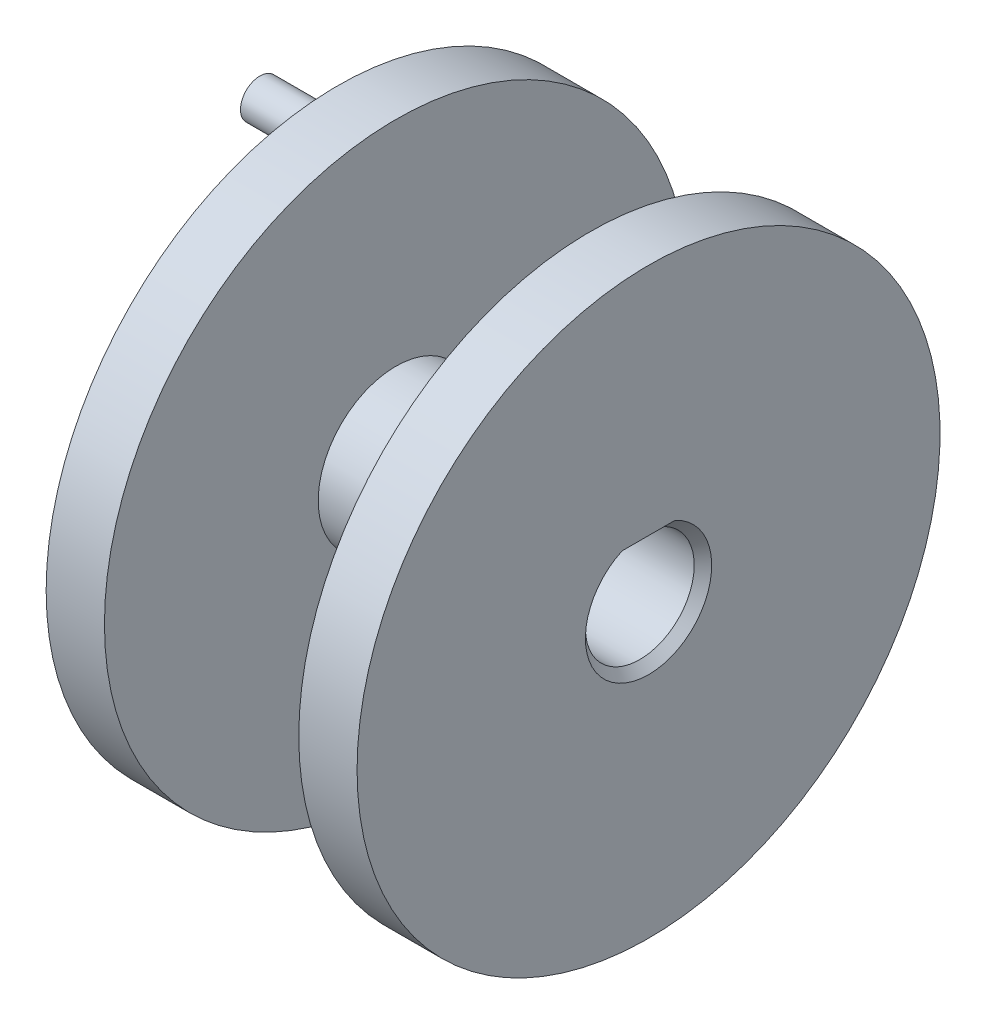
ISO-10303-21;
HEADER;
FILE_DESCRIPTION(('STEP AP214'),'2;1');
FILE_NAME('part.step','',(''),(''),'','','');
FILE_SCHEMA(('AUTOMOTIVE_DESIGN { 1 0 10303 214 1 1 1 1 }'));
ENDSEC;
DATA;
#1=APPLICATION_CONTEXT('core data for automotive mechanical design processes');
#2=APPLICATION_PROTOCOL_DEFINITION('international standard','automotive_design',2000,#1);
#3=PRODUCT_CONTEXT('',#1,'mechanical');
#4=PRODUCT('Part','Part','',(#3));
#5=PRODUCT_RELATED_PRODUCT_CATEGORY('part','',(#4));
#6=PRODUCT_DEFINITION_FORMATION('','',#4);
#7=PRODUCT_DEFINITION_CONTEXT('part definition',#1,'design');
#8=PRODUCT_DEFINITION('design','',#6,#7);
#9=PRODUCT_DEFINITION_SHAPE('','',#8);
#10=(LENGTH_UNIT() NAMED_UNIT(*) SI_UNIT(.MILLI.,.METRE.));
#11=(NAMED_UNIT(*) PLANE_ANGLE_UNIT() SI_UNIT($,.RADIAN.));
#12=(NAMED_UNIT(*) SI_UNIT($,.STERADIAN.) SOLID_ANGLE_UNIT());
#13=UNCERTAINTY_MEASURE_WITH_UNIT(LENGTH_MEASURE(1.E-05),#10,'distance_accuracy_value','');
#14=(GEOMETRIC_REPRESENTATION_CONTEXT(3) GLOBAL_UNCERTAINTY_ASSIGNED_CONTEXT((#13)) GLOBAL_UNIT_ASSIGNED_CONTEXT((#10,
#11,#12)) REPRESENTATION_CONTEXT('',''));
#15=CARTESIAN_POINT('',(0.,0.,0.));
#16=DIRECTION('',(0.,0.,1.));
#17=DIRECTION('',(1.,0.,0.));
#18=AXIS2_PLACEMENT_3D('',#15,#16,#17);
#19=CARTESIAN_POINT('',(8.,0.,0.));
#20=DIRECTION('',(1.,0.,0.));
#21=DIRECTION('',(0.,0.,-1.));
#22=AXIS2_PLACEMENT_3D('',#19,#20,#21);
#23=PLANE('',#22);
#24=DIRECTION('',(0.,0.,-1.));
#25=VECTOR('',#24,1.);
#26=CARTESIAN_POINT('',(8.,2.95000000000001,0.));
#27=LINE('',#26,#25);
#28=CARTESIAN_POINT('',(8.,2.95000000000001,1.36381816969859));
#29=VERTEX_POINT('',#28);
#30=CARTESIAN_POINT('',(8.,2.95000000000001,-1.36381816969859));
#31=VERTEX_POINT('',#30);
#32=EDGE_CURVE('E72',#29,#31,#27,.T.);
#33=ORIENTED_EDGE('',*,*,#32,.T.);
#34=CARTESIAN_POINT('',(8.,0.,0.));
#35=DIRECTION('',(1.,0.,0.));
#36=DIRECTION('',(0.,0.,-1.));
#37=AXIS2_PLACEMENT_3D('',#34,#35,#36);
#38=CIRCLE('',#37,3.25000000000001);
#39=EDGE_CURVE('E65',#31,#29,#38,.F.);
#40=ORIENTED_EDGE('',*,*,#39,.T.);
#41=EDGE_LOOP('',(#33,#40));
#42=FACE_BOUND('',#41,.T.);
#43=CARTESIAN_POINT('',(8.,0.,0.));
#44=DIRECTION('',(-1.,0.,0.));
#45=DIRECTION('',(0.,0.,1.));
#46=AXIS2_PLACEMENT_3D('',#43,#44,#45);
#47=CIRCLE('',#46,15.);
#48=CARTESIAN_POINT('',(8.,0.,15.));
#49=VERTEX_POINT('',#48);
#50=EDGE_CURVE('E129',#49,#49,#47,.T.);
#51=ORIENTED_EDGE('',*,*,#50,.F.);
#52=EDGE_LOOP('',(#51));
#53=FACE_BOUND('',#52,.T.);
#54=ADVANCED_FACE('F49',(#42,#53),#23,.T.);
#55=CARTESIAN_POINT('',(-8.,0.,0.));
#56=DIRECTION('',(-1.,0.,0.));
#57=DIRECTION('',(0.,0.,-1.));
#58=AXIS2_PLACEMENT_3D('',#55,#56,#57);
#59=PLANE('',#58);
#60=CARTESIAN_POINT('',(-8.,12.4335183609525,0.));
#61=DIRECTION('',(-1.,0.,0.));
#62=DIRECTION('',(0.,0.,1.));
#63=AXIS2_PLACEMENT_3D('',#60,#61,#62);
#64=CIRCLE('',#63,1.);
#65=CARTESIAN_POINT('',(-8.,12.4335183609525,1.));
#66=VERTEX_POINT('',#65);
#67=EDGE_CURVE('E118',#66,#66,#64,.T.);
#68=ORIENTED_EDGE('',*,*,#67,.F.);
#69=EDGE_LOOP('',(#68));
#70=FACE_BOUND('',#69,.T.);
#71=CARTESIAN_POINT('',(-8.,0.,0.));
#72=DIRECTION('',(-1.,0.,0.));
#73=DIRECTION('',(0.,0.,1.));
#74=AXIS2_PLACEMENT_3D('',#71,#72,#73);
#75=CIRCLE('',#74,15.);
#76=CARTESIAN_POINT('',(-8.,0.,15.));
#77=VERTEX_POINT('',#76);
#78=EDGE_CURVE('E110',#77,#77,#75,.T.);
#79=ORIENTED_EDGE('',*,*,#78,.T.);
#80=EDGE_LOOP('',(#79));
#81=FACE_BOUND('',#80,.T.);
#82=CARTESIAN_POINT('',(-8.,0.,0.));
#83=DIRECTION('',(1.,0.,0.));
#84=DIRECTION('',(0.,0.,-1.));
#85=AXIS2_PLACEMENT_3D('',#82,#83,#84);
#86=CIRCLE('',#85,2.8);
#87=CARTESIAN_POINT('',(-8.,2.5,1.26095202129185));
#88=VERTEX_POINT('',#87);
#89=CARTESIAN_POINT('',(-8.,2.5,-1.26095202129185));
#90=VERTEX_POINT('',#89);
#91=EDGE_CURVE('E106',#88,#90,#86,.T.);
#92=ORIENTED_EDGE('',*,*,#91,.T.);
#93=DIRECTION('',(0.,0.,-1.));
#94=VECTOR('',#93,1.);
#95=CARTESIAN_POINT('',(-8.,2.5,0.));
#96=LINE('',#95,#94);
#97=EDGE_CURVE('E97',#88,#90,#96,.T.);
#98=ORIENTED_EDGE('',*,*,#97,.F.);
#99=EDGE_LOOP('',(#92,#98));
#100=FACE_BOUND('',#99,.T.);
#101=ADVANCED_FACE('F112',(#70,#81,#100),#59,.T.);
#102=CARTESIAN_POINT('',(5.,0.,0.));
#103=DIRECTION('',(-1.,0.,0.));
#104=DIRECTION('',(0.,0.,1.));
#105=AXIS2_PLACEMENT_3D('',#102,#103,#104);
#106=CYLINDRICAL_SURFACE('',#105,4.);
#107=CARTESIAN_POINT('',(5.,0.,0.));
#108=DIRECTION('',(1.,0.,0.));
#109=DIRECTION('',(0.,0.,-1.));
#110=AXIS2_PLACEMENT_3D('',#107,#108,#109);
#111=CIRCLE('',#110,4.);
#112=CARTESIAN_POINT('',(5.,0.,-4.));
#113=VERTEX_POINT('',#112);
#114=EDGE_CURVE('E138',#113,#113,#111,.T.);
#115=ORIENTED_EDGE('',*,*,#114,.F.);
#116=EDGE_LOOP('',(#115));
#117=FACE_BOUND('',#116,.T.);
#118=CARTESIAN_POINT('',(-5.,0.,0.));
#119=DIRECTION('',(1.,0.,0.));
#120=DIRECTION('',(0.,0.,-1.));
#121=AXIS2_PLACEMENT_3D('',#118,#119,#120);
#122=CIRCLE('',#121,4.);
#123=CARTESIAN_POINT('',(-5.,0.,-4.));
#124=VERTEX_POINT('',#123);
#125=EDGE_CURVE('E128',#124,#124,#122,.T.);
#126=ORIENTED_EDGE('',*,*,#125,.T.);
#127=EDGE_LOOP('',(#126));
#128=FACE_BOUND('',#127,.T.);
#129=ADVANCED_FACE('F165',(#117,#128),#106,.T.);
#130=CARTESIAN_POINT('',(0.,0.,0.));
#131=DIRECTION('',(-1.,0.,0.));
#132=DIRECTION('',(0.,0.,1.));
#133=AXIS2_PLACEMENT_3D('',#130,#131,#132);
#134=CYLINDRICAL_SURFACE('',#133,15.);
#135=ORIENTED_EDGE('',*,*,#50,.T.);
#136=EDGE_LOOP('',(#135));
#137=FACE_BOUND('',#136,.T.);
#138=CARTESIAN_POINT('',(5.,0.,0.));
#139=DIRECTION('',(-1.,0.,0.));
#140=DIRECTION('',(0.,0.,1.));
#141=AXIS2_PLACEMENT_3D('',#138,#139,#140);
#142=CIRCLE('',#141,15.);
#143=CARTESIAN_POINT('',(5.,0.,15.));
#144=VERTEX_POINT('',#143);
#145=EDGE_CURVE('E104',#144,#144,#142,.T.);
#146=ORIENTED_EDGE('',*,*,#145,.F.);
#147=EDGE_LOOP('',(#146));
#148=FACE_BOUND('',#147,.T.);
#149=ADVANCED_FACE('F169',(#137,#148),#134,.T.);
#150=CARTESIAN_POINT('',(5.,0.,0.));
#151=DIRECTION('',(1.,0.,0.));
#152=DIRECTION('',(0.,0.,-1.));
#153=AXIS2_PLACEMENT_3D('',#150,#151,#152);
#154=PLANE('',#153);
#155=ORIENTED_EDGE('',*,*,#114,.T.);
#156=EDGE_LOOP('',(#155));
#157=FACE_BOUND('',#156,.T.);
#158=ORIENTED_EDGE('',*,*,#145,.T.);
#159=EDGE_LOOP('',(#158));
#160=FACE_BOUND('',#159,.T.);
#161=ADVANCED_FACE('F178',(#157,#160),#154,.F.);
#162=CARTESIAN_POINT('',(0.,0.,0.));
#163=DIRECTION('',(1.,0.,0.));
#164=DIRECTION('',(0.,0.,1.));
#165=AXIS2_PLACEMENT_3D('',#162,#163,#164);
#166=CYLINDRICAL_SURFACE('',#165,15.);
#167=ORIENTED_EDGE('',*,*,#78,.F.);
#168=EDGE_LOOP('',(#167));
#169=FACE_BOUND('',#168,.T.);
#170=CARTESIAN_POINT('',(-5.,0.,0.));
#171=DIRECTION('',(-1.,0.,0.));
#172=DIRECTION('',(0.,0.,1.));
#173=AXIS2_PLACEMENT_3D('',#170,#171,#172);
#174=CIRCLE('',#173,15.);
#175=CARTESIAN_POINT('',(-5.,0.,15.));
#176=VERTEX_POINT('',#175);
#177=EDGE_CURVE('E124',#176,#176,#174,.T.);
#178=ORIENTED_EDGE('',*,*,#177,.T.);
#179=EDGE_LOOP('',(#178));
#180=FACE_BOUND('',#179,.T.);
#181=ADVANCED_FACE('F182',(#169,#180),#166,.T.);
#182=CARTESIAN_POINT('',(-5.,0.,0.));
#183=DIRECTION('',(-1.,0.,0.));
#184=DIRECTION('',(0.,0.,-1.));
#185=AXIS2_PLACEMENT_3D('',#182,#183,#184);
#186=PLANE('',#185);
#187=ORIENTED_EDGE('',*,*,#125,.F.);
#188=EDGE_LOOP('',(#187));
#189=FACE_BOUND('',#188,.T.);
#190=ORIENTED_EDGE('',*,*,#177,.F.);
#191=EDGE_LOOP('',(#190));
#192=FACE_BOUND('',#191,.T.);
#193=ADVANCED_FACE('F175',(#189,#192),#186,.F.);
#194=CARTESIAN_POINT('',(5.,2.5,1.26095202129185));
#195=DIRECTION('',(0.,-1.,0.));
#196=DIRECTION('',(0.,0.,-1.));
#197=AXIS2_PLACEMENT_3D('',#194,#195,#196);
#198=PLANE('',#197);
#199=DIRECTION('',(-1.,0.,0.));
#200=VECTOR('',#199,1.);
#201=CARTESIAN_POINT('',(5.,2.5,-1.26095202129185));
#202=LINE('',#201,#200);
#203=CARTESIAN_POINT('',(7.54999999999999,2.5,-1.26095202129185));
#204=VERTEX_POINT('',#203);
#205=EDGE_CURVE('E103',#204,#90,#202,.T.);
#206=ORIENTED_EDGE('',*,*,#205,.F.);
#207=DIRECTION('',(0.,0.,1.));
#208=VECTOR('',#207,1.);
#209=CARTESIAN_POINT('',(7.54999999999999,2.5,1.26095202129185));
#210=LINE('',#209,#208);
#211=CARTESIAN_POINT('',(7.54999999999999,2.5,1.26095202129185));
#212=VERTEX_POINT('',#211);
#213=EDGE_CURVE('E11',#204,#212,#210,.T.);
#214=ORIENTED_EDGE('',*,*,#213,.T.);
#215=DIRECTION('',(-1.,0.,0.));
#216=VECTOR('',#215,1.);
#217=CARTESIAN_POINT('',(5.,2.5,1.26095202129185));
#218=LINE('',#217,#216);
#219=EDGE_CURVE('E92',#212,#88,#218,.T.);
#220=ORIENTED_EDGE('',*,*,#219,.T.);
#221=ORIENTED_EDGE('',*,*,#97,.T.);
#222=EDGE_LOOP('',(#206,#214,#220,#221));
#223=FACE_BOUND('',#222,.T.);
#224=ADVANCED_FACE('F95',(#223),#198,.T.);
#225=CARTESIAN_POINT('',(5.,0.,0.));
#226=DIRECTION('',(-1.,0.,0.));
#227=DIRECTION('',(0.,0.,1.));
#228=AXIS2_PLACEMENT_3D('',#225,#226,#227);
#229=CYLINDRICAL_SURFACE('',#228,2.8);
#230=ORIENTED_EDGE('',*,*,#219,.F.);
#231=CARTESIAN_POINT('',(7.54999999999999,0.,0.));
#232=DIRECTION('',(1.,0.,0.));
#233=DIRECTION('',(0.,0.,-1.));
#234=AXIS2_PLACEMENT_3D('',#231,#232,#233);
#235=CIRCLE('',#234,2.8);
#236=EDGE_CURVE('E142',#212,#204,#235,.T.);
#237=ORIENTED_EDGE('',*,*,#236,.T.);
#238=ORIENTED_EDGE('',*,*,#205,.T.);
#239=ORIENTED_EDGE('',*,*,#91,.F.);
#240=EDGE_LOOP('',(#230,#237,#238,#239));
#241=FACE_BOUND('',#240,.T.);
#242=ADVANCED_FACE('F107',(#241),#229,.F.);
#243=CARTESIAN_POINT('',(8.,2.95000000000001,0.));
#244=DIRECTION('',(-0.707106781186553,0.707106781186542,0.));
#245=DIRECTION('',(0.,0.,-1.));
#246=AXIS2_PLACEMENT_3D('',#243,#244,#245);
#247=PLANE('',#246);
#248=CARTESIAN_POINT('',(7.54999999999999,2.5,-1.26095202129185));
#249=CARTESIAN_POINT('',(7.62492524079987,2.57492524079988,-1.27875094222944));
#250=CARTESIAN_POINT('',(7.69988788779887,2.64988788779888,-1.29622258757448));
#251=CARTESIAN_POINT('',(7.8498878879049,2.79988788790491,-1.33051130278243));
#252=CARTESIAN_POINT('',(7.9249252409059,2.87492524090591,-1.34732837357297));
#253=CARTESIAN_POINT('',(8.,2.95000000000001,-1.36381816969859));
#254=B_SPLINE_CURVE_WITH_KNOTS('',3,(#248,#249,#250,#251,#252,#253),.UNSPECIFIED.,.F.,.F.,(4,2,
4),(0.,0.322329796220115,0.644659135633889),.UNSPECIFIED.);
#255=EDGE_CURVE('E116',#31,#204,#254,.F.);
#256=ORIENTED_EDGE('',*,*,#255,.F.);
#257=ORIENTED_EDGE('',*,*,#32,.F.);
#258=CARTESIAN_POINT('',(8.,2.95000000000001,1.36381816969859));
#259=CARTESIAN_POINT('',(7.92492524090607,2.87492524090608,1.34732837357159));
#260=CARTESIAN_POINT('',(7.84988788790507,2.79988788790508,1.33051130278105));
#261=CARTESIAN_POINT('',(7.69988788779874,2.64988788779875,1.29622258757586));
#262=CARTESIAN_POINT('',(7.62492524079943,2.57492524079944,1.27875094223357));
#263=CARTESIAN_POINT('',(7.54999999999908,2.49999999999909,1.26095202130011));
#264=B_SPLINE_CURVE_WITH_KNOTS('',3,(#258,#259,#260,#261,#262,#263),.UNSPECIFIED.,.F.,.F.,(4,2,
4),(0.,0.322329339413751,0.644659135633814),.UNSPECIFIED.);
#265=EDGE_CURVE('E55',#212,#29,#264,.F.);
#266=ORIENTED_EDGE('',*,*,#265,.F.);
#267=ORIENTED_EDGE('',*,*,#213,.F.);
#268=EDGE_LOOP('',(#256,#257,#266,#267));
#269=FACE_BOUND('',#268,.T.);
#270=ADVANCED_FACE('F52',(#269),#247,.F.);
#271=CARTESIAN_POINT('',(7.54999999999999,0.,0.));
#272=DIRECTION('',(1.,0.,0.));
#273=DIRECTION('',(0.,0.,-1.));
#274=AXIS2_PLACEMENT_3D('',#271,#272,#273);
#275=CONICAL_SURFACE('',#274,2.8,0.785398163397456);
#276=ORIENTED_EDGE('',*,*,#265,.T.);
#277=ORIENTED_EDGE('',*,*,#39,.F.);
#278=ORIENTED_EDGE('',*,*,#255,.T.);
#279=ORIENTED_EDGE('',*,*,#236,.F.);
#280=EDGE_LOOP('',(#276,#277,#278,#279));
#281=FACE_BOUND('',#280,.T.);
#282=ADVANCED_FACE('F158',(#281),#275,.F.);
#283=CARTESIAN_POINT('',(-12.,12.4335183609525,0.));
#284=DIRECTION('',(1.,0.,0.));
#285=DIRECTION('',(0.,0.,-1.));
#286=AXIS2_PLACEMENT_3D('',#283,#284,#285);
#287=CYLINDRICAL_SURFACE('',#286,1.);
#288=CARTESIAN_POINT('',(-12.,12.4335183609525,0.));
#289=DIRECTION('',(-1.,0.,0.));
#290=DIRECTION('',(0.,0.,1.));
#291=AXIS2_PLACEMENT_3D('',#288,#289,#290);
#292=CIRCLE('',#291,1.);
#293=CARTESIAN_POINT('',(-12.,12.4335183609525,1.));
#294=VERTEX_POINT('',#293);
#295=EDGE_CURVE('E156',#294,#294,#292,.T.);
#296=ORIENTED_EDGE('',*,*,#295,.F.);
#297=EDGE_LOOP('',(#296));
#298=FACE_BOUND('',#297,.T.);
#299=ORIENTED_EDGE('',*,*,#67,.T.);
#300=EDGE_LOOP('',(#299));
#301=FACE_BOUND('',#300,.T.);
#302=ADVANCED_FACE('F164',(#298,#301),#287,.T.);
#303=CARTESIAN_POINT('',(-12.,12.4335183609525,0.));
#304=DIRECTION('',(-1.,0.,0.));
#305=DIRECTION('',(0.,0.,1.));
#306=AXIS2_PLACEMENT_3D('',#303,#304,#305);
#307=PLANE('',#306);
#308=ORIENTED_EDGE('',*,*,#295,.T.);
#309=EDGE_LOOP('',(#308));
#310=FACE_BOUND('',#309,.T.);
#311=ADVANCED_FACE('F197',(#310),#307,.T.);
#312=CLOSED_SHELL('',(#54,#101,#129,#149,#161,#181,#193,#224,#242,#270,#282,#302,#311));
#313=MANIFOLD_SOLID_BREP('B2',#312);
#314=ADVANCED_BREP_SHAPE_REPRESENTATION('',(#18,#313),#14);
#315=SHAPE_DEFINITION_REPRESENTATION(#9,#314);
ENDSEC;
END-ISO-10303-21;
